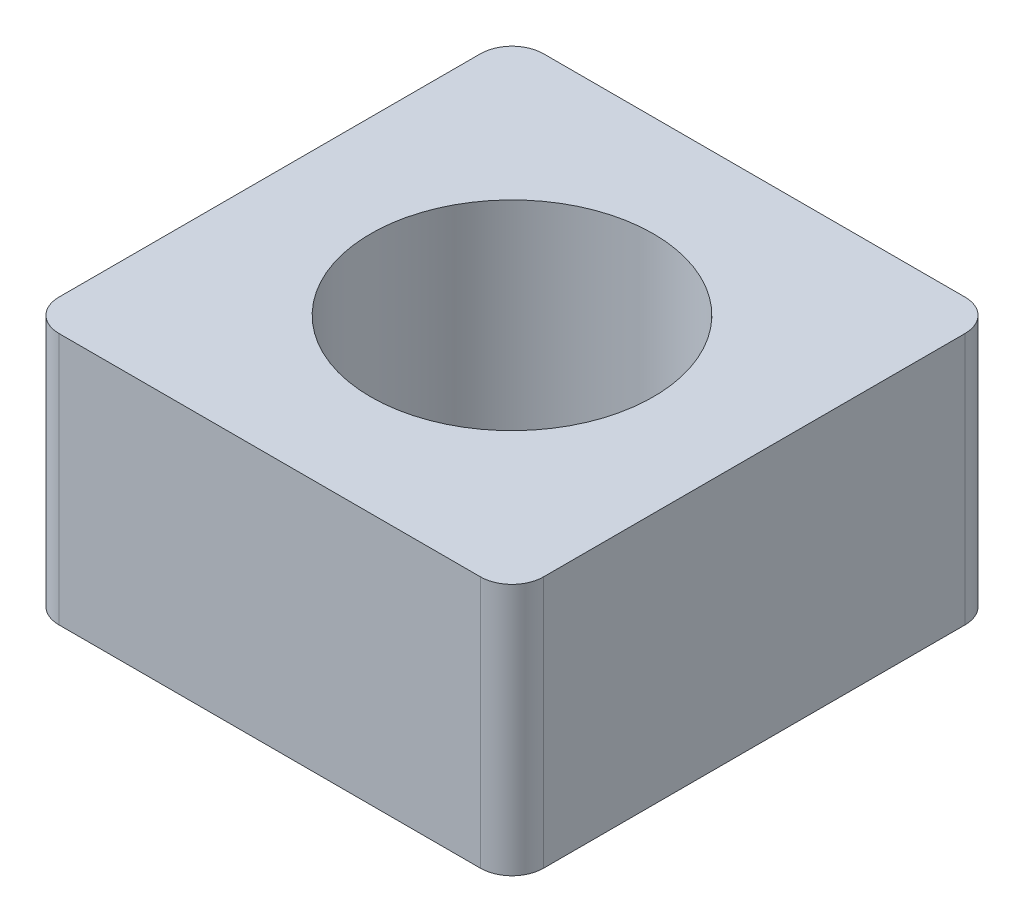
ISO-10303-21;
HEADER;
FILE_DESCRIPTION(('STEP AP214'),'2;1');
FILE_NAME('part.step','',(''),(''),'','','');
FILE_SCHEMA(('AUTOMOTIVE_DESIGN { 1 0 10303 214 1 1 1 1 }'));
ENDSEC;
DATA;
#1=APPLICATION_CONTEXT('core data for automotive mechanical design processes');
#2=APPLICATION_PROTOCOL_DEFINITION('international standard','automotive_design',2000,#1);
#3=PRODUCT_CONTEXT('',#1,'mechanical');
#4=PRODUCT('Part','Part','',(#3));
#5=PRODUCT_RELATED_PRODUCT_CATEGORY('part','',(#4));
#6=PRODUCT_DEFINITION_FORMATION('','',#4);
#7=PRODUCT_DEFINITION_CONTEXT('part definition',#1,'design');
#8=PRODUCT_DEFINITION('design','',#6,#7);
#9=PRODUCT_DEFINITION_SHAPE('','',#8);
#10=(LENGTH_UNIT() NAMED_UNIT(*) SI_UNIT(.MILLI.,.METRE.));
#11=(NAMED_UNIT(*) PLANE_ANGLE_UNIT() SI_UNIT($,.RADIAN.));
#12=(NAMED_UNIT(*) SI_UNIT($,.STERADIAN.) SOLID_ANGLE_UNIT());
#13=UNCERTAINTY_MEASURE_WITH_UNIT(LENGTH_MEASURE(1.E-05),#10,'distance_accuracy_value','');
#14=(GEOMETRIC_REPRESENTATION_CONTEXT(3) GLOBAL_UNCERTAINTY_ASSIGNED_CONTEXT((#13)) GLOBAL_UNIT_ASSIGNED_CONTEXT((#10,
#11,#12)) REPRESENTATION_CONTEXT('',''));
#15=CARTESIAN_POINT('',(0.,0.,0.));
#16=DIRECTION('',(0.,0.,1.));
#17=DIRECTION('',(1.,0.,0.));
#18=AXIS2_PLACEMENT_3D('',#15,#16,#17);
#19=CARTESIAN_POINT('',(0.,3.175,0.));
#20=DIRECTION('',(0.,-1.,0.));
#21=DIRECTION('',(0.,0.,-1.));
#22=AXIS2_PLACEMENT_3D('',#19,#20,#21);
#23=PLANE('',#22);
#24=DIRECTION('',(0.,0.,1.));
#25=VECTOR('',#24,1.);
#26=CARTESIAN_POINT('',(-3.048,3.175,3.048));
#27=LINE('',#26,#25);
#28=CARTESIAN_POINT('',(-3.048,3.175,-2.651125));
#29=VERTEX_POINT('',#28);
#30=CARTESIAN_POINT('',(-3.048,3.175,2.651125));
#31=VERTEX_POINT('',#30);
#32=EDGE_CURVE('E170',#29,#31,#27,.T.);
#33=ORIENTED_EDGE('',*,*,#32,.T.);
#34=CARTESIAN_POINT('',(-2.651125,3.175,2.651125));
#35=DIRECTION('',(0.,-1.,0.));
#36=DIRECTION('',(0.,0.,-1.));
#37=AXIS2_PLACEMENT_3D('',#34,#35,#36);
#38=CIRCLE('',#37,0.396875);
#39=CARTESIAN_POINT('',(-2.651125,3.175,3.048));
#40=VERTEX_POINT('',#39);
#41=EDGE_CURVE('E147',#31,#40,#38,.F.);
#42=ORIENTED_EDGE('',*,*,#41,.T.);
#43=DIRECTION('',(1.,0.,0.));
#44=VECTOR('',#43,1.);
#45=CARTESIAN_POINT('',(-3.048,3.175,3.048));
#46=LINE('',#45,#44);
#47=CARTESIAN_POINT('',(2.651125,3.175,3.048));
#48=VERTEX_POINT('',#47);
#49=EDGE_CURVE('E118',#40,#48,#46,.T.);
#50=ORIENTED_EDGE('',*,*,#49,.T.);
#51=CARTESIAN_POINT('',(2.651125,3.175,2.651125));
#52=DIRECTION('',(0.,-1.,0.));
#53=DIRECTION('',(0.,0.,-1.));
#54=AXIS2_PLACEMENT_3D('',#51,#52,#53);
#55=CIRCLE('',#54,0.396875);
#56=CARTESIAN_POINT('',(3.048,3.175,2.651125));
#57=VERTEX_POINT('',#56);
#58=EDGE_CURVE('E145',#48,#57,#55,.F.);
#59=ORIENTED_EDGE('',*,*,#58,.T.);
#60=DIRECTION('',(0.,0.,-1.));
#61=VECTOR('',#60,1.);
#62=CARTESIAN_POINT('',(3.048,3.175,3.048));
#63=LINE('',#62,#61);
#64=CARTESIAN_POINT('',(3.048,3.175,-2.651125));
#65=VERTEX_POINT('',#64);
#66=EDGE_CURVE('E125',#57,#65,#63,.T.);
#67=ORIENTED_EDGE('',*,*,#66,.T.);
#68=CARTESIAN_POINT('',(2.651125,3.175,-2.651125));
#69=DIRECTION('',(0.,-1.,0.));
#70=DIRECTION('',(0.,0.,-1.));
#71=AXIS2_PLACEMENT_3D('',#68,#69,#70);
#72=CIRCLE('',#71,0.396875);
#73=CARTESIAN_POINT('',(2.651125,3.175,-3.048));
#74=VERTEX_POINT('',#73);
#75=EDGE_CURVE('E53',#65,#74,#72,.F.);
#76=ORIENTED_EDGE('',*,*,#75,.T.);
#77=DIRECTION('',(-1.,0.,0.));
#78=VECTOR('',#77,1.);
#79=CARTESIAN_POINT('',(-3.048,3.175,-3.048));
#80=LINE('',#79,#78);
#81=CARTESIAN_POINT('',(-2.651125,3.175,-3.048));
#82=VERTEX_POINT('',#81);
#83=EDGE_CURVE('E128',#74,#82,#80,.T.);
#84=ORIENTED_EDGE('',*,*,#83,.T.);
#85=CARTESIAN_POINT('',(-2.651125,3.175,-2.651125));
#86=DIRECTION('',(0.,-1.,0.));
#87=DIRECTION('',(0.,0.,-1.));
#88=AXIS2_PLACEMENT_3D('',#85,#86,#87);
#89=CIRCLE('',#88,0.396875);
#90=EDGE_CURVE('E142',#82,#29,#89,.F.);
#91=ORIENTED_EDGE('',*,*,#90,.T.);
#92=EDGE_LOOP('',(#33,#42,#50,#59,#67,#76,#84,#91));
#93=FACE_BOUND('',#92,.T.);
#94=CARTESIAN_POINT('',(0.,3.175,0.));
#95=DIRECTION('',(0.,1.,0.));
#96=DIRECTION('',(0.,0.,1.));
#97=AXIS2_PLACEMENT_3D('',#94,#95,#96);
#98=CIRCLE('',#97,1.778);
#99=CARTESIAN_POINT('',(0.,3.175,1.778));
#100=VERTEX_POINT('',#99);
#101=EDGE_CURVE('E163',#100,#100,#98,.T.);
#102=ORIENTED_EDGE('',*,*,#101,.F.);
#103=EDGE_LOOP('',(#102));
#104=FACE_BOUND('',#103,.T.);
#105=ADVANCED_FACE('F32',(#93,#104),#23,.F.);
#106=CARTESIAN_POINT('',(0.,0.,0.));
#107=DIRECTION('',(0.,-1.,0.));
#108=DIRECTION('',(0.,0.,-1.));
#109=AXIS2_PLACEMENT_3D('',#106,#107,#108);
#110=PLANE('',#109);
#111=DIRECTION('',(1.,0.,0.));
#112=VECTOR('',#111,1.);
#113=CARTESIAN_POINT('',(-3.048,0.,3.048));
#114=LINE('',#113,#112);
#115=CARTESIAN_POINT('',(-2.651125,0.,3.048));
#116=VERTEX_POINT('',#115);
#117=CARTESIAN_POINT('',(2.651125,0.,3.048));
#118=VERTEX_POINT('',#117);
#119=EDGE_CURVE('E115',#116,#118,#114,.T.);
#120=ORIENTED_EDGE('',*,*,#119,.F.);
#121=CARTESIAN_POINT('',(-2.651125,0.,2.651125));
#122=DIRECTION('',(0.,-1.,0.));
#123=DIRECTION('',(0.,0.,-1.));
#124=AXIS2_PLACEMENT_3D('',#121,#122,#123);
#125=CIRCLE('',#124,0.396875);
#126=CARTESIAN_POINT('',(-3.048,0.,2.651125));
#127=VERTEX_POINT('',#126);
#128=EDGE_CURVE('E98',#116,#127,#125,.T.);
#129=ORIENTED_EDGE('',*,*,#128,.T.);
#130=DIRECTION('',(0.,0.,1.));
#131=VECTOR('',#130,1.);
#132=CARTESIAN_POINT('',(-3.048,0.,3.048));
#133=LINE('',#132,#131);
#134=CARTESIAN_POINT('',(-3.048,0.,-2.651125));
#135=VERTEX_POINT('',#134);
#136=EDGE_CURVE('E126',#135,#127,#133,.T.);
#137=ORIENTED_EDGE('',*,*,#136,.F.);
#138=CARTESIAN_POINT('',(-2.651125,0.,-2.651125));
#139=DIRECTION('',(0.,-1.,0.));
#140=DIRECTION('',(0.,0.,-1.));
#141=AXIS2_PLACEMENT_3D('',#138,#139,#140);
#142=CIRCLE('',#141,0.396875);
#143=CARTESIAN_POINT('',(-2.651125,0.,-3.048));
#144=VERTEX_POINT('',#143);
#145=EDGE_CURVE('E119',#135,#144,#142,.T.);
#146=ORIENTED_EDGE('',*,*,#145,.T.);
#147=DIRECTION('',(-1.,0.,0.));
#148=VECTOR('',#147,1.);
#149=CARTESIAN_POINT('',(-3.048,0.,-3.048));
#150=LINE('',#149,#148);
#151=CARTESIAN_POINT('',(2.651125,0.,-3.048));
#152=VERTEX_POINT('',#151);
#153=EDGE_CURVE('E130',#152,#144,#150,.T.);
#154=ORIENTED_EDGE('',*,*,#153,.F.);
#155=CARTESIAN_POINT('',(2.651125,0.,-2.651125));
#156=DIRECTION('',(0.,-1.,0.));
#157=DIRECTION('',(0.,0.,-1.));
#158=AXIS2_PLACEMENT_3D('',#155,#156,#157);
#159=CIRCLE('',#158,0.396875);
#160=CARTESIAN_POINT('',(3.048,0.,-2.651125));
#161=VERTEX_POINT('',#160);
#162=EDGE_CURVE('E136',#152,#161,#159,.T.);
#163=ORIENTED_EDGE('',*,*,#162,.T.);
#164=DIRECTION('',(0.,0.,-1.));
#165=VECTOR('',#164,1.);
#166=CARTESIAN_POINT('',(3.048,0.,3.048));
#167=LINE('',#166,#165);
#168=CARTESIAN_POINT('',(3.048,0.,2.651125));
#169=VERTEX_POINT('',#168);
#170=EDGE_CURVE('E158',#169,#161,#167,.T.);
#171=ORIENTED_EDGE('',*,*,#170,.F.);
#172=CARTESIAN_POINT('',(2.651125,0.,2.651125));
#173=DIRECTION('',(0.,-1.,0.));
#174=DIRECTION('',(0.,0.,-1.));
#175=AXIS2_PLACEMENT_3D('',#172,#173,#174);
#176=CIRCLE('',#175,0.396875);
#177=EDGE_CURVE('E109',#169,#118,#176,.T.);
#178=ORIENTED_EDGE('',*,*,#177,.T.);
#179=EDGE_LOOP('',(#120,#129,#137,#146,#154,#163,#171,#178));
#180=FACE_BOUND('',#179,.T.);
#181=CARTESIAN_POINT('',(0.,0.,0.));
#182=DIRECTION('',(0.,1.,0.));
#183=DIRECTION('',(0.,0.,1.));
#184=AXIS2_PLACEMENT_3D('',#181,#182,#183);
#185=CIRCLE('',#184,1.778);
#186=CARTESIAN_POINT('',(0.,0.,1.778));
#187=VERTEX_POINT('',#186);
#188=EDGE_CURVE('E166',#187,#187,#185,.T.);
#189=ORIENTED_EDGE('',*,*,#188,.T.);
#190=EDGE_LOOP('',(#189));
#191=FACE_BOUND('',#190,.T.);
#192=ADVANCED_FACE('F122',(#180,#191),#110,.T.);
#193=CARTESIAN_POINT('',(3.048,3.175,3.048));
#194=DIRECTION('',(-1.,0.,0.));
#195=DIRECTION('',(0.,0.,1.));
#196=AXIS2_PLACEMENT_3D('',#193,#194,#195);
#197=PLANE('',#196);
#198=ORIENTED_EDGE('',*,*,#66,.F.);
#199=DIRECTION('',(0.,-1.,0.));
#200=VECTOR('',#199,1.);
#201=CARTESIAN_POINT('',(3.048,3.175,2.651125));
#202=LINE('',#201,#200);
#203=EDGE_CURVE('E151',#57,#169,#202,.T.);
#204=ORIENTED_EDGE('',*,*,#203,.T.);
#205=ORIENTED_EDGE('',*,*,#170,.T.);
#206=DIRECTION('',(0.,-1.,0.));
#207=VECTOR('',#206,1.);
#208=CARTESIAN_POINT('',(3.048,3.175,-2.651125));
#209=LINE('',#208,#207);
#210=EDGE_CURVE('E149',#161,#65,#209,.F.);
#211=ORIENTED_EDGE('',*,*,#210,.T.);
#212=EDGE_LOOP('',(#198,#204,#205,#211));
#213=FACE_BOUND('',#212,.T.);
#214=ADVANCED_FACE('F157',(#213),#197,.F.);
#215=CARTESIAN_POINT('',(-3.048,3.175,-3.048));
#216=DIRECTION('',(0.,0.,1.));
#217=DIRECTION('',(1.,0.,0.));
#218=AXIS2_PLACEMENT_3D('',#215,#216,#217);
#219=PLANE('',#218);
#220=ORIENTED_EDGE('',*,*,#83,.F.);
#221=DIRECTION('',(0.,-1.,0.));
#222=VECTOR('',#221,1.);
#223=CARTESIAN_POINT('',(2.651125,3.175,-3.048));
#224=LINE('',#223,#222);
#225=EDGE_CURVE('E11',#74,#152,#224,.T.);
#226=ORIENTED_EDGE('',*,*,#225,.T.);
#227=ORIENTED_EDGE('',*,*,#153,.T.);
#228=DIRECTION('',(0.,-1.,0.));
#229=VECTOR('',#228,1.);
#230=CARTESIAN_POINT('',(-2.651125,3.175,-3.048));
#231=LINE('',#230,#229);
#232=EDGE_CURVE('E40',#144,#82,#231,.F.);
#233=ORIENTED_EDGE('',*,*,#232,.T.);
#234=EDGE_LOOP('',(#220,#226,#227,#233));
#235=FACE_BOUND('',#234,.T.);
#236=ADVANCED_FACE('F199',(#235),#219,.F.);
#237=CARTESIAN_POINT('',(-3.048,3.175,3.048));
#238=DIRECTION('',(1.,0.,0.));
#239=DIRECTION('',(0.,0.,-1.));
#240=AXIS2_PLACEMENT_3D('',#237,#238,#239);
#241=PLANE('',#240);
#242=ORIENTED_EDGE('',*,*,#136,.T.);
#243=DIRECTION('',(0.,-1.,0.));
#244=VECTOR('',#243,1.);
#245=CARTESIAN_POINT('',(-3.048,3.175,2.651125));
#246=LINE('',#245,#244);
#247=EDGE_CURVE('E103',#127,#31,#246,.F.);
#248=ORIENTED_EDGE('',*,*,#247,.T.);
#249=ORIENTED_EDGE('',*,*,#32,.F.);
#250=DIRECTION('',(0.,-1.,0.));
#251=VECTOR('',#250,1.);
#252=CARTESIAN_POINT('',(-3.048,3.175,-2.651125));
#253=LINE('',#252,#251);
#254=EDGE_CURVE('E108',#29,#135,#253,.T.);
#255=ORIENTED_EDGE('',*,*,#254,.T.);
#256=EDGE_LOOP('',(#242,#248,#249,#255));
#257=FACE_BOUND('',#256,.T.);
#258=ADVANCED_FACE('F187',(#257),#241,.F.);
#259=CARTESIAN_POINT('',(-3.048,3.175,3.048));
#260=DIRECTION('',(0.,0.,-1.));
#261=DIRECTION('',(-1.,0.,0.));
#262=AXIS2_PLACEMENT_3D('',#259,#260,#261);
#263=PLANE('',#262);
#264=ORIENTED_EDGE('',*,*,#49,.F.);
#265=DIRECTION('',(0.,-1.,0.));
#266=VECTOR('',#265,1.);
#267=CARTESIAN_POINT('',(-2.651125,3.175,3.048));
#268=LINE('',#267,#266);
#269=EDGE_CURVE('E102',#40,#116,#268,.T.);
#270=ORIENTED_EDGE('',*,*,#269,.T.);
#271=ORIENTED_EDGE('',*,*,#119,.T.);
#272=DIRECTION('',(0.,-1.,0.));
#273=VECTOR('',#272,1.);
#274=CARTESIAN_POINT('',(2.651125,3.175,3.048));
#275=LINE('',#274,#273);
#276=EDGE_CURVE('E120',#118,#48,#275,.F.);
#277=ORIENTED_EDGE('',*,*,#276,.T.);
#278=EDGE_LOOP('',(#264,#270,#271,#277));
#279=FACE_BOUND('',#278,.T.);
#280=ADVANCED_FACE('F114',(#279),#263,.F.);
#281=CARTESIAN_POINT('',(0.,3.175,0.));
#282=DIRECTION('',(0.,-1.,0.));
#283=DIRECTION('',(0.,0.,-1.));
#284=AXIS2_PLACEMENT_3D('',#281,#282,#283);
#285=CYLINDRICAL_SURFACE('',#284,1.778);
#286=ORIENTED_EDGE('',*,*,#101,.T.);
#287=EDGE_LOOP('',(#286));
#288=FACE_BOUND('',#287,.T.);
#289=ORIENTED_EDGE('',*,*,#188,.F.);
#290=EDGE_LOOP('',(#289));
#291=FACE_BOUND('',#290,.T.);
#292=ADVANCED_FACE('F177',(#288,#291),#285,.F.);
#293=CARTESIAN_POINT('',(-2.651125,3.175,2.651125));
#294=DIRECTION('',(0.,-1.,0.));
#295=DIRECTION('',(0.,0.,-1.));
#296=AXIS2_PLACEMENT_3D('',#293,#294,#295);
#297=CYLINDRICAL_SURFACE('',#296,0.396875);
#298=ORIENTED_EDGE('',*,*,#41,.F.);
#299=ORIENTED_EDGE('',*,*,#247,.F.);
#300=ORIENTED_EDGE('',*,*,#128,.F.);
#301=ORIENTED_EDGE('',*,*,#269,.F.);
#302=EDGE_LOOP('',(#298,#299,#300,#301));
#303=FACE_BOUND('',#302,.T.);
#304=ADVANCED_FACE('F101',(#303),#297,.T.);
#305=CARTESIAN_POINT('',(2.651125,3.175,2.651125));
#306=DIRECTION('',(0.,-1.,0.));
#307=DIRECTION('',(0.,0.,-1.));
#308=AXIS2_PLACEMENT_3D('',#305,#306,#307);
#309=CYLINDRICAL_SURFACE('',#308,0.396875);
#310=ORIENTED_EDGE('',*,*,#58,.F.);
#311=ORIENTED_EDGE('',*,*,#276,.F.);
#312=ORIENTED_EDGE('',*,*,#177,.F.);
#313=ORIENTED_EDGE('',*,*,#203,.F.);
#314=EDGE_LOOP('',(#310,#311,#312,#313));
#315=FACE_BOUND('',#314,.T.);
#316=ADVANCED_FACE('F185',(#315),#309,.T.);
#317=CARTESIAN_POINT('',(2.651125,3.175,-2.651125));
#318=DIRECTION('',(0.,-1.,0.));
#319=DIRECTION('',(0.,0.,-1.));
#320=AXIS2_PLACEMENT_3D('',#317,#318,#319);
#321=CYLINDRICAL_SURFACE('',#320,0.396875);
#322=ORIENTED_EDGE('',*,*,#75,.F.);
#323=ORIENTED_EDGE('',*,*,#210,.F.);
#324=ORIENTED_EDGE('',*,*,#162,.F.);
#325=ORIENTED_EDGE('',*,*,#225,.F.);
#326=EDGE_LOOP('',(#322,#323,#324,#325));
#327=FACE_BOUND('',#326,.T.);
#328=ADVANCED_FACE('F206',(#327),#321,.T.);
#329=CARTESIAN_POINT('',(-2.651125,3.175,-2.651125));
#330=DIRECTION('',(0.,-1.,0.));
#331=DIRECTION('',(0.,0.,-1.));
#332=AXIS2_PLACEMENT_3D('',#329,#330,#331);
#333=CYLINDRICAL_SURFACE('',#332,0.396875);
#334=ORIENTED_EDGE('',*,*,#90,.F.);
#335=ORIENTED_EDGE('',*,*,#232,.F.);
#336=ORIENTED_EDGE('',*,*,#145,.F.);
#337=ORIENTED_EDGE('',*,*,#254,.F.);
#338=EDGE_LOOP('',(#334,#335,#336,#337));
#339=FACE_BOUND('',#338,.T.);
#340=ADVANCED_FACE('F34',(#339),#333,.T.);
#341=CLOSED_SHELL('',(#105,#192,#214,#236,#258,#280,#292,#304,#316,#328,#340));
#342=MANIFOLD_SOLID_BREP('B2',#341);
#343=ADVANCED_BREP_SHAPE_REPRESENTATION('',(#18,#342),#14);
#344=SHAPE_DEFINITION_REPRESENTATION(#9,#343);
ENDSEC;
END-ISO-10303-21;
